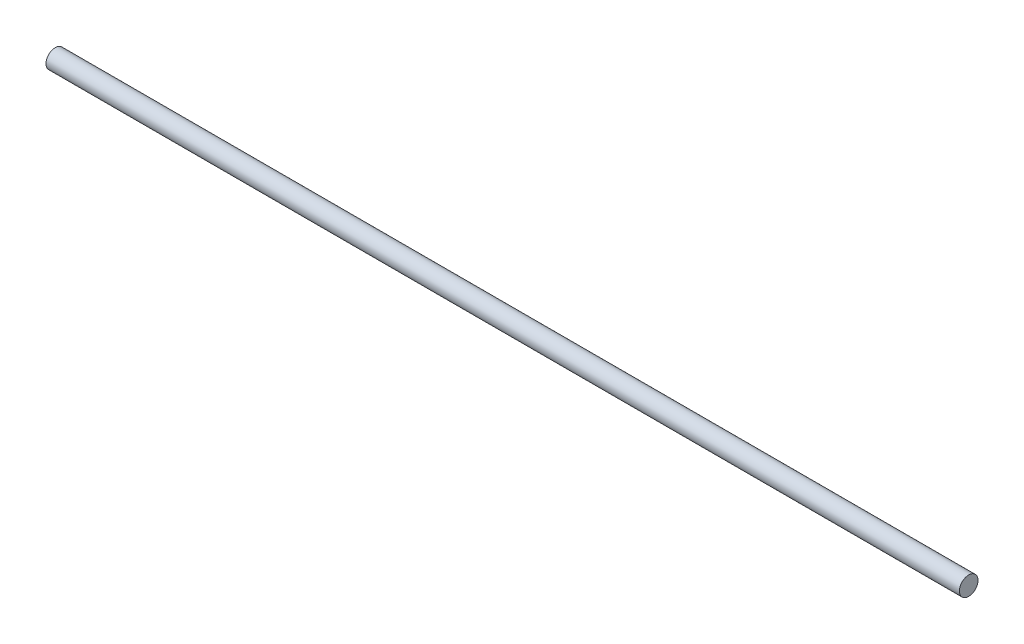
ISO-10303-21;
HEADER;
FILE_DESCRIPTION(('STEP AP214'),'2;1');
FILE_NAME('part.step','',(''),(''),'','','');
FILE_SCHEMA(('AUTOMOTIVE_DESIGN { 1 0 10303 214 1 1 1 1 }'));
ENDSEC;
DATA;
#1=APPLICATION_CONTEXT('core data for automotive mechanical design processes');
#2=APPLICATION_PROTOCOL_DEFINITION('international standard','automotive_design',2000,#1);
#3=PRODUCT_CONTEXT('',#1,'mechanical');
#4=PRODUCT('Part','Part','',(#3));
#5=PRODUCT_RELATED_PRODUCT_CATEGORY('part','',(#4));
#6=PRODUCT_DEFINITION_FORMATION('','',#4);
#7=PRODUCT_DEFINITION_CONTEXT('part definition',#1,'design');
#8=PRODUCT_DEFINITION('design','',#6,#7);
#9=PRODUCT_DEFINITION_SHAPE('','',#8);
#10=(LENGTH_UNIT() NAMED_UNIT(*) SI_UNIT(.MILLI.,.METRE.));
#11=(NAMED_UNIT(*) PLANE_ANGLE_UNIT() SI_UNIT($,.RADIAN.));
#12=(NAMED_UNIT(*) SI_UNIT($,.STERADIAN.) SOLID_ANGLE_UNIT());
#13=UNCERTAINTY_MEASURE_WITH_UNIT(LENGTH_MEASURE(1.E-05),#10,'distance_accuracy_value','');
#14=(GEOMETRIC_REPRESENTATION_CONTEXT(3) GLOBAL_UNCERTAINTY_ASSIGNED_CONTEXT((#13)) GLOBAL_UNIT_ASSIGNED_CONTEXT((#10,
#11,#12)) REPRESENTATION_CONTEXT('',''));
#15=CARTESIAN_POINT('',(0.,0.,0.));
#16=DIRECTION('',(0.,0.,1.));
#17=DIRECTION('',(1.,0.,0.));
#18=AXIS2_PLACEMENT_3D('',#15,#16,#17);
#19=CARTESIAN_POINT('',(97.5,0.,0.));
#20=DIRECTION('',(-1.,0.,0.));
#21=DIRECTION('',(0.,0.,1.));
#22=AXIS2_PLACEMENT_3D('',#19,#20,#21);
#23=CYLINDRICAL_SURFACE('',#22,1.985);
#24=CARTESIAN_POINT('',(97.5,0.,0.));
#25=DIRECTION('',(1.,0.,0.));
#26=DIRECTION('',(0.,0.,-1.));
#27=AXIS2_PLACEMENT_3D('',#24,#25,#26);
#28=CIRCLE('',#27,1.985);
#29=CARTESIAN_POINT('',(97.5,0.,-1.985));
#30=VERTEX_POINT('',#29);
#31=EDGE_CURVE('E10',#30,#30,#28,.T.);
#32=ORIENTED_EDGE('',*,*,#31,.F.);
#33=EDGE_LOOP('',(#32));
#34=FACE_BOUND('',#33,.T.);
#35=CARTESIAN_POINT('',(-97.5,0.,0.));
#36=DIRECTION('',(1.,0.,0.));
#37=DIRECTION('',(0.,0.,-1.));
#38=AXIS2_PLACEMENT_3D('',#35,#36,#37);
#39=CIRCLE('',#38,1.985);
#40=CARTESIAN_POINT('',(-97.5,0.,-1.985));
#41=VERTEX_POINT('',#40);
#42=EDGE_CURVE('E46',#41,#41,#39,.T.);
#43=ORIENTED_EDGE('',*,*,#42,.T.);
#44=EDGE_LOOP('',(#43));
#45=FACE_BOUND('',#44,.T.);
#46=ADVANCED_FACE('F43',(#34,#45),#23,.T.);
#47=CARTESIAN_POINT('',(97.5,0.,0.));
#48=DIRECTION('',(1.,0.,0.));
#49=DIRECTION('',(0.,0.,-1.));
#50=AXIS2_PLACEMENT_3D('',#47,#48,#49);
#51=PLANE('',#50);
#52=ORIENTED_EDGE('',*,*,#31,.T.);
#53=EDGE_LOOP('',(#52));
#54=FACE_BOUND('',#53,.T.);
#55=ADVANCED_FACE('F60',(#54),#51,.T.);
#56=CARTESIAN_POINT('',(-97.5,0.,0.));
#57=DIRECTION('',(1.,0.,0.));
#58=DIRECTION('',(0.,0.,-1.));
#59=AXIS2_PLACEMENT_3D('',#56,#57,#58);
#60=PLANE('',#59);
#61=ORIENTED_EDGE('',*,*,#42,.F.);
#62=EDGE_LOOP('',(#61));
#63=FACE_BOUND('',#62,.T.);
#64=ADVANCED_FACE('F58',(#63),#60,.F.);
#65=CLOSED_SHELL('',(#46,#55,#64));
#66=MANIFOLD_SOLID_BREP('B2',#65);
#67=ADVANCED_BREP_SHAPE_REPRESENTATION('',(#18,#66),#14);
#68=SHAPE_DEFINITION_REPRESENTATION(#9,#67);
ENDSEC;
END-ISO-10303-21;
